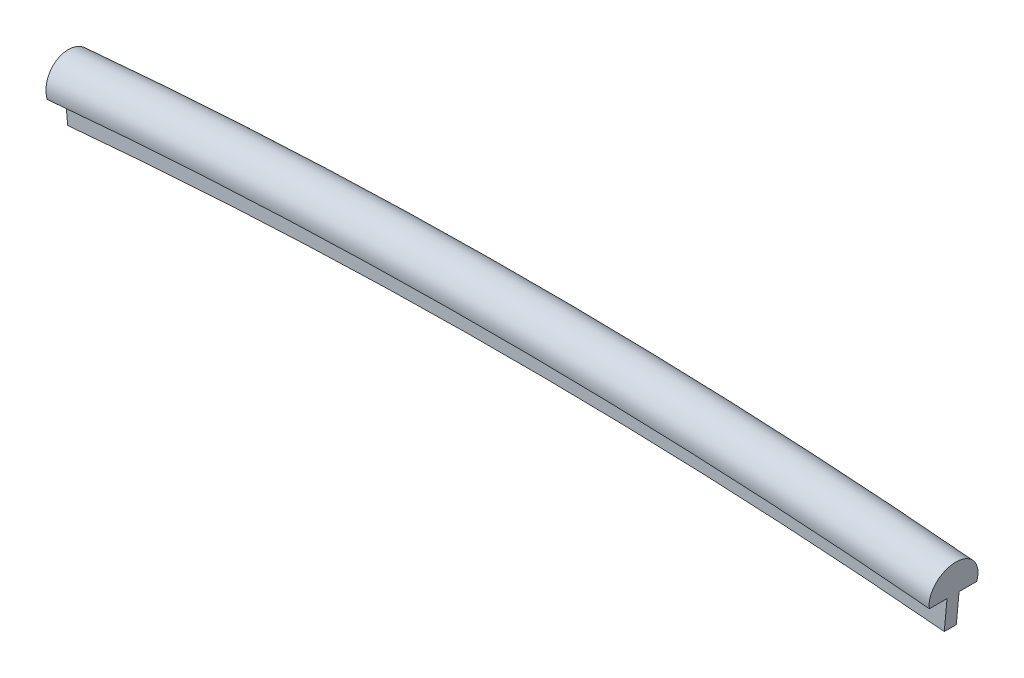
ISO-10303-21;
HEADER;
FILE_DESCRIPTION(('STEP AP214'),'2;1');
FILE_NAME('part.step','',(''),(''),'','','');
FILE_SCHEMA(('AUTOMOTIVE_DESIGN { 1 0 10303 214 1 1 1 1 }'));
ENDSEC;
DATA;
#1=APPLICATION_CONTEXT('core data for automotive mechanical design processes');
#2=APPLICATION_PROTOCOL_DEFINITION('international standard','automotive_design',2000,#1);
#3=PRODUCT_CONTEXT('',#1,'mechanical');
#4=PRODUCT('Part','Part','',(#3));
#5=PRODUCT_RELATED_PRODUCT_CATEGORY('part','',(#4));
#6=PRODUCT_DEFINITION_FORMATION('','',#4);
#7=PRODUCT_DEFINITION_CONTEXT('part definition',#1,'design');
#8=PRODUCT_DEFINITION('design','',#6,#7);
#9=PRODUCT_DEFINITION_SHAPE('','',#8);
#10=(LENGTH_UNIT() NAMED_UNIT(*) SI_UNIT(.MILLI.,.METRE.));
#11=(NAMED_UNIT(*) PLANE_ANGLE_UNIT() SI_UNIT($,.RADIAN.));
#12=(NAMED_UNIT(*) SI_UNIT($,.STERADIAN.) SOLID_ANGLE_UNIT());
#13=UNCERTAINTY_MEASURE_WITH_UNIT(LENGTH_MEASURE(1.E-05),#10,'distance_accuracy_value','');
#14=(GEOMETRIC_REPRESENTATION_CONTEXT(3) GLOBAL_UNCERTAINTY_ASSIGNED_CONTEXT((#13)) GLOBAL_UNIT_ASSIGNED_CONTEXT((#10,
#11,#12)) REPRESENTATION_CONTEXT('',''));
#15=CARTESIAN_POINT('',(0.,0.,0.));
#16=DIRECTION('',(0.,0.,1.));
#17=DIRECTION('',(1.,0.,0.));
#18=AXIS2_PLACEMENT_3D('',#15,#16,#17);
#19=CARTESIAN_POINT('',(0.,0.,70.5976415970385));
#20=DIRECTION('',(0.,0.,1.));
#21=DIRECTION('',(1.,0.,0.));
#22=AXIS2_PLACEMENT_3D('',#19,#20,#21);
#23=CYLINDRICAL_SURFACE('',#22,241.3);
#24=CARTESIAN_POINT('',(0.,0.,1.18));
#25=DIRECTION('',(0.,0.,1.));
#26=DIRECTION('',(1.,0.,0.));
#27=AXIS2_PLACEMENT_3D('',#24,#25,#26);
#28=CIRCLE('',#27,241.3);
#29=CARTESIAN_POINT('',(21.9944481398543,240.295514421354,1.18));
#30=VERTEX_POINT('',#29);
#31=CARTESIAN_POINT('',(-21.9944481398543,240.295514421354,1.18));
#32=VERTEX_POINT('',#31);
#33=EDGE_CURVE('E11',#30,#32,#28,.T.);
#34=ORIENTED_EDGE('',*,*,#33,.T.);
#35=DIRECTION('',(0.,0.,-1.));
#36=VECTOR('',#35,1.);
#37=CARTESIAN_POINT('',(-21.9944481398543,240.295514421354,1.18));
#38=LINE('',#37,#36);
#39=CARTESIAN_POINT('',(-21.9944481398543,240.295514421354,0.3));
#40=VERTEX_POINT('',#39);
#41=EDGE_CURVE('E103',#32,#40,#38,.T.);
#42=ORIENTED_EDGE('',*,*,#41,.T.);
#43=CARTESIAN_POINT('',(0.,0.,0.299999999999995));
#44=DIRECTION('',(0.,0.,1.));
#45=DIRECTION('',(1.,0.,0.));
#46=AXIS2_PLACEMENT_3D('',#43,#44,#45);
#47=CIRCLE('',#46,241.3);
#48=CARTESIAN_POINT('',(21.9944481398543,240.295514421354,0.3));
#49=VERTEX_POINT('',#48);
#50=EDGE_CURVE('E85',#49,#40,#47,.T.);
#51=ORIENTED_EDGE('',*,*,#50,.F.);
#52=DIRECTION('',(0.,0.,-1.));
#53=VECTOR('',#52,1.);
#54=CARTESIAN_POINT('',(21.9944481398543,240.295514421354,1.18));
#55=LINE('',#54,#53);
#56=EDGE_CURVE('E117',#30,#49,#55,.T.);
#57=ORIENTED_EDGE('',*,*,#56,.F.);
#58=EDGE_LOOP('',(#34,#42,#51,#57));
#59=FACE_BOUND('',#58,.T.);
#60=ADVANCED_FACE('F33',(#59),#23,.F.);
#61=CARTESIAN_POINT('',(0.,0.,0.));
#62=DIRECTION('',(0.,0.,1.));
#63=DIRECTION('',(1.,0.,0.));
#64=AXIS2_PLACEMENT_3D('',#61,#62,#63);
#65=TOROIDAL_SURFACE('',#64,241.586013989906,1.21416802890791);
#66=CARTESIAN_POINT('',(0.,0.,-1.18));
#67=DIRECTION('',(0.,0.,1.));
#68=DIRECTION('',(1.,0.,0.));
#69=AXIS2_PLACEMENT_3D('',#66,#67,#68);
#70=CIRCLE('',#69,241.3);
#71=CARTESIAN_POINT('',(21.9944481398543,240.295514421354,-1.18));
#72=VERTEX_POINT('',#71);
#73=CARTESIAN_POINT('',(-21.9944481398543,240.295514421354,-1.18));
#74=VERTEX_POINT('',#73);
#75=EDGE_CURVE('E41',#72,#74,#70,.T.);
#76=ORIENTED_EDGE('',*,*,#75,.T.);
#77=CARTESIAN_POINT('',(-22.0205182594907,240.580337789925,0.));
#78=DIRECTION('',(0.995837191965828,0.0911498058013026,0.));
#79=DIRECTION('',(0.,0.,1.));
#80=AXIS2_PLACEMENT_3D('',#77,#78,#79);
#81=CIRCLE('',#80,1.21416802890791);
#82=EDGE_CURVE('E115',#74,#32,#81,.T.);
#83=ORIENTED_EDGE('',*,*,#82,.T.);
#84=ORIENTED_EDGE('',*,*,#33,.F.);
#85=CARTESIAN_POINT('',(22.0205182594907,240.580337789925,0.));
#86=DIRECTION('',(0.995837191965828,-0.0911498058013026,0.));
#87=DIRECTION('',(0.,0.,1.));
#88=AXIS2_PLACEMENT_3D('',#85,#86,#87);
#89=CIRCLE('',#88,1.21416802890791);
#90=EDGE_CURVE('E97',#72,#30,#89,.T.);
#91=ORIENTED_EDGE('',*,*,#90,.F.);
#92=EDGE_LOOP('',(#76,#83,#84,#91));
#93=FACE_BOUND('',#92,.T.);
#94=ADVANCED_FACE('F35',(#93),#65,.T.);
#95=CARTESIAN_POINT('',(0.,0.,70.5976415970385));
#96=DIRECTION('',(0.,0.,1.));
#97=DIRECTION('',(1.,0.,0.));
#98=AXIS2_PLACEMENT_3D('',#95,#96,#97);
#99=CYLINDRICAL_SURFACE('',#98,241.3);
#100=CARTESIAN_POINT('',(0.,0.,-0.299999999999995));
#101=DIRECTION('',(0.,0.,1.));
#102=DIRECTION('',(1.,0.,0.));
#103=AXIS2_PLACEMENT_3D('',#100,#101,#102);
#104=CIRCLE('',#103,241.3);
#105=CARTESIAN_POINT('',(21.9944481398543,240.295514421354,-0.3));
#106=VERTEX_POINT('',#105);
#107=CARTESIAN_POINT('',(-21.9944481398543,240.295514421354,-0.3));
#108=VERTEX_POINT('',#107);
#109=EDGE_CURVE('E132',#106,#108,#104,.T.);
#110=ORIENTED_EDGE('',*,*,#109,.T.);
#111=DIRECTION('',(0.,0.,-1.));
#112=VECTOR('',#111,1.);
#113=CARTESIAN_POINT('',(-21.9944481398543,240.295514421354,-0.3));
#114=LINE('',#113,#112);
#115=EDGE_CURVE('E113',#108,#74,#114,.T.);
#116=ORIENTED_EDGE('',*,*,#115,.T.);
#117=ORIENTED_EDGE('',*,*,#75,.F.);
#118=DIRECTION('',(0.,0.,-1.));
#119=VECTOR('',#118,1.);
#120=CARTESIAN_POINT('',(21.9944481398543,240.295514421354,-0.3));
#121=LINE('',#120,#119);
#122=EDGE_CURVE('E125',#106,#72,#121,.T.);
#123=ORIENTED_EDGE('',*,*,#122,.F.);
#124=EDGE_LOOP('',(#110,#116,#117,#123));
#125=FACE_BOUND('',#124,.T.);
#126=ADVANCED_FACE('F134',(#125),#99,.F.);
#127=CARTESIAN_POINT('',(21.8577234311524,238.801758633405,-0.3));
#128=DIRECTION('',(0.,0.,1.));
#129=DIRECTION('',(1.,0.,0.));
#130=AXIS2_PLACEMENT_3D('',#127,#128,#129);
#131=PLANE('',#130);
#132=CARTESIAN_POINT('',(0.,0.,-0.299999999999995));
#133=DIRECTION('',(0.,0.,1.));
#134=DIRECTION('',(1.,0.,0.));
#135=AXIS2_PLACEMENT_3D('',#132,#133,#134);
#136=CIRCLE('',#135,239.8);
#137=CARTESIAN_POINT('',(21.8577234311524,238.801758633405,-0.3));
#138=VERTEX_POINT('',#137);
#139=CARTESIAN_POINT('',(-21.8577234311524,238.801758633405,-0.3));
#140=VERTEX_POINT('',#139);
#141=EDGE_CURVE('E129',#138,#140,#136,.T.);
#142=ORIENTED_EDGE('',*,*,#141,.T.);
#143=DIRECTION('',(-0.0911498058013026,0.995837191965828,0.));
#144=VECTOR('',#143,1.);
#145=CARTESIAN_POINT('',(-21.8577234311524,238.801758633405,-0.3));
#146=LINE('',#145,#144);
#147=EDGE_CURVE('E110',#140,#108,#146,.T.);
#148=ORIENTED_EDGE('',*,*,#147,.T.);
#149=ORIENTED_EDGE('',*,*,#109,.F.);
#150=DIRECTION('',(0.0911498058013026,0.995837191965828,0.));
#151=VECTOR('',#150,1.);
#152=CARTESIAN_POINT('',(21.8577234311524,238.801758633405,-0.3));
#153=LINE('',#152,#151);
#154=EDGE_CURVE('E122',#138,#106,#153,.T.);
#155=ORIENTED_EDGE('',*,*,#154,.F.);
#156=EDGE_LOOP('',(#142,#148,#149,#155));
#157=FACE_BOUND('',#156,.T.);
#158=ADVANCED_FACE('F136',(#157),#131,.F.);
#159=CARTESIAN_POINT('',(0.,0.,70.5976415970385));
#160=DIRECTION('',(0.,0.,1.));
#161=DIRECTION('',(1.,0.,0.));
#162=AXIS2_PLACEMENT_3D('',#159,#160,#161);
#163=CYLINDRICAL_SURFACE('',#162,239.8);
#164=CARTESIAN_POINT('',(0.,0.,0.299999999999995));
#165=DIRECTION('',(0.,0.,1.));
#166=DIRECTION('',(1.,0.,0.));
#167=AXIS2_PLACEMENT_3D('',#164,#165,#166);
#168=CIRCLE('',#167,239.8);
#169=CARTESIAN_POINT('',(21.8577234311524,238.801758633405,0.3));
#170=VERTEX_POINT('',#169);
#171=CARTESIAN_POINT('',(-21.8577234311524,238.801758633405,0.3));
#172=VERTEX_POINT('',#171);
#173=EDGE_CURVE('E96',#170,#172,#168,.T.);
#174=ORIENTED_EDGE('',*,*,#173,.T.);
#175=DIRECTION('',(0.,0.,-1.));
#176=VECTOR('',#175,1.);
#177=CARTESIAN_POINT('',(-21.8577234311524,238.801758633405,0.));
#178=LINE('',#177,#176);
#179=EDGE_CURVE('E105',#172,#140,#178,.T.);
#180=ORIENTED_EDGE('',*,*,#179,.T.);
#181=ORIENTED_EDGE('',*,*,#141,.F.);
#182=DIRECTION('',(0.,0.,-1.));
#183=VECTOR('',#182,1.);
#184=CARTESIAN_POINT('',(21.8577234311524,238.801758633405,0.));
#185=LINE('',#184,#183);
#186=EDGE_CURVE('E120',#170,#138,#185,.T.);
#187=ORIENTED_EDGE('',*,*,#186,.F.);
#188=EDGE_LOOP('',(#174,#180,#181,#187));
#189=FACE_BOUND('',#188,.T.);
#190=ADVANCED_FACE('F141',(#189),#163,.F.);
#191=CARTESIAN_POINT('',(21.8577234311524,238.801758633405,0.3));
#192=DIRECTION('',(0.,0.,-1.));
#193=DIRECTION('',(-1.,0.,0.));
#194=AXIS2_PLACEMENT_3D('',#191,#192,#193);
#195=PLANE('',#194);
#196=DIRECTION('',(-0.0911498058013026,-0.995837191965828,0.));
#197=VECTOR('',#196,1.);
#198=CARTESIAN_POINT('',(21.8577234311524,238.801758633405,0.3));
#199=LINE('',#198,#197);
#200=EDGE_CURVE('E91',#49,#170,#199,.T.);
#201=ORIENTED_EDGE('',*,*,#200,.F.);
#202=ORIENTED_EDGE('',*,*,#50,.T.);
#203=DIRECTION('',(0.0911498058013026,-0.995837191965828,0.));
#204=VECTOR('',#203,1.);
#205=CARTESIAN_POINT('',(-21.8577234311524,238.801758633405,0.3));
#206=LINE('',#205,#204);
#207=EDGE_CURVE('E88',#40,#172,#206,.T.);
#208=ORIENTED_EDGE('',*,*,#207,.T.);
#209=ORIENTED_EDGE('',*,*,#173,.F.);
#210=EDGE_LOOP('',(#201,#202,#208,#209));
#211=FACE_BOUND('',#210,.T.);
#212=ADVANCED_FACE('F87',(#211),#195,.F.);
#213=CARTESIAN_POINT('',(22.0205182594907,240.580337789925,0.));
#214=DIRECTION('',(-0.995837191965828,0.0911498058013026,0.));
#215=DIRECTION('',(0.,0.,1.));
#216=AXIS2_PLACEMENT_3D('',#213,#214,#215);
#217=PLANE('',#216);
#218=ORIENTED_EDGE('',*,*,#56,.T.);
#219=ORIENTED_EDGE('',*,*,#200,.T.);
#220=ORIENTED_EDGE('',*,*,#186,.T.);
#221=ORIENTED_EDGE('',*,*,#154,.T.);
#222=ORIENTED_EDGE('',*,*,#122,.T.);
#223=ORIENTED_EDGE('',*,*,#90,.T.);
#224=EDGE_LOOP('',(#218,#219,#220,#221,#222,#223));
#225=FACE_BOUND('',#224,.T.);
#226=ADVANCED_FACE('F143',(#225),#217,.F.);
#227=CARTESIAN_POINT('',(-22.0205182594907,240.580337789925,0.));
#228=DIRECTION('',(-0.995837191965828,-0.0911498058013026,0.));
#229=DIRECTION('',(0.,0.,1.));
#230=AXIS2_PLACEMENT_3D('',#227,#228,#229);
#231=PLANE('',#230);
#232=ORIENTED_EDGE('',*,*,#41,.F.);
#233=ORIENTED_EDGE('',*,*,#82,.F.);
#234=ORIENTED_EDGE('',*,*,#115,.F.);
#235=ORIENTED_EDGE('',*,*,#147,.F.);
#236=ORIENTED_EDGE('',*,*,#179,.F.);
#237=ORIENTED_EDGE('',*,*,#207,.F.);
#238=EDGE_LOOP('',(#232,#233,#234,#235,#236,#237));
#239=FACE_BOUND('',#238,.T.);
#240=ADVANCED_FACE('F101',(#239),#231,.T.);
#241=CLOSED_SHELL('',(#60,#94,#126,#158,#190,#212,#226,#240));
#242=MANIFOLD_SOLID_BREP('B2',#241);
#243=ADVANCED_BREP_SHAPE_REPRESENTATION('',(#18,#242),#14);
#244=SHAPE_DEFINITION_REPRESENTATION(#9,#243);
ENDSEC;
END-ISO-10303-21;
